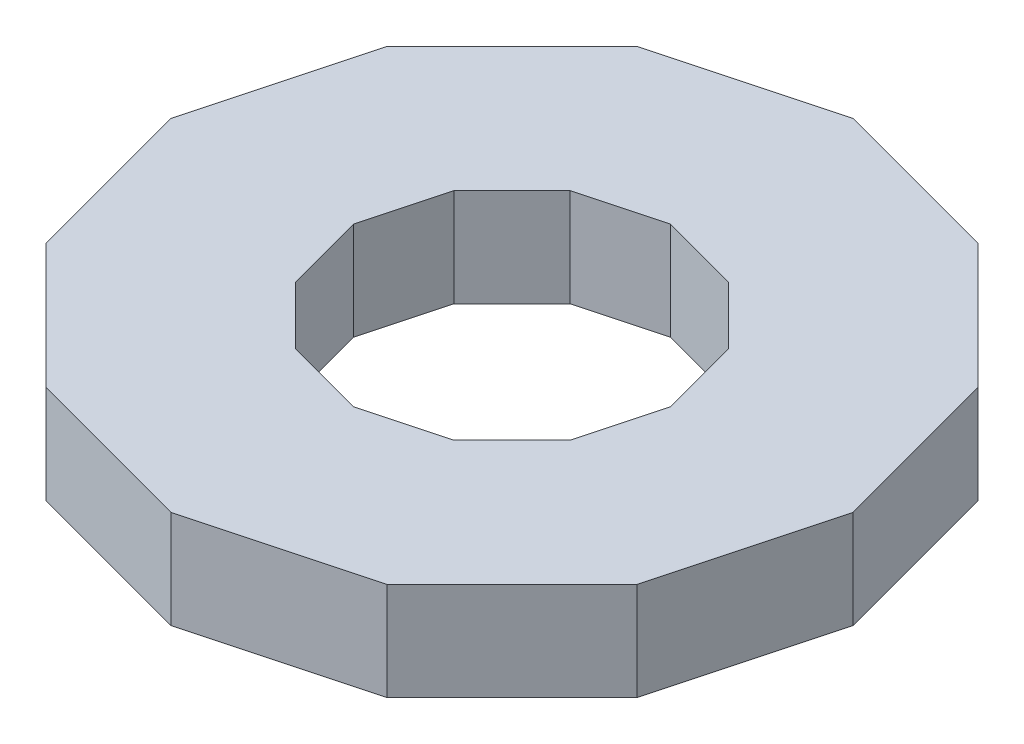
ISO-10303-21;
HEADER;
FILE_DESCRIPTION(('STEP AP214'),'2;1');
FILE_NAME('part.step','',(''),(''),'','','');
FILE_SCHEMA(('AUTOMOTIVE_DESIGN { 1 0 10303 214 1 1 1 1 }'));
ENDSEC;
DATA;
#1=APPLICATION_CONTEXT('core data for automotive mechanical design processes');
#2=APPLICATION_PROTOCOL_DEFINITION('international standard','automotive_design',2000,#1);
#3=PRODUCT_CONTEXT('',#1,'mechanical');
#4=PRODUCT('Part','Part','',(#3));
#5=PRODUCT_RELATED_PRODUCT_CATEGORY('part','',(#4));
#6=PRODUCT_DEFINITION_FORMATION('','',#4);
#7=PRODUCT_DEFINITION_CONTEXT('part definition',#1,'design');
#8=PRODUCT_DEFINITION('design','',#6,#7);
#9=PRODUCT_DEFINITION_SHAPE('','',#8);
#10=(LENGTH_UNIT() NAMED_UNIT(*) SI_UNIT(.MILLI.,.METRE.));
#11=(NAMED_UNIT(*) PLANE_ANGLE_UNIT() SI_UNIT($,.RADIAN.));
#12=(NAMED_UNIT(*) SI_UNIT($,.STERADIAN.) SOLID_ANGLE_UNIT());
#13=UNCERTAINTY_MEASURE_WITH_UNIT(LENGTH_MEASURE(1.E-05),#10,'distance_accuracy_value','');
#14=(GEOMETRIC_REPRESENTATION_CONTEXT(3) GLOBAL_UNCERTAINTY_ASSIGNED_CONTEXT((#13)) GLOBAL_UNIT_ASSIGNED_CONTEXT((#10,
#11,#12)) REPRESENTATION_CONTEXT('',''));
#15=CARTESIAN_POINT('',(0.,0.,0.));
#16=DIRECTION('',(0.,0.,1.));
#17=DIRECTION('',(1.,0.,0.));
#18=AXIS2_PLACEMENT_3D('',#15,#16,#17);
#19=CARTESIAN_POINT('',(0.,19.05,0.));
#20=DIRECTION('',(0.,1.,0.));
#21=DIRECTION('',(0.,0.,1.));
#22=AXIS2_PLACEMENT_3D('',#19,#20,#21);
#23=PLANE('',#22);
#24=DIRECTION('',(0.258819045102521,0.,-0.965925826289068));
#25=VECTOR('',#24,1.);
#26=CARTESIAN_POINT('',(57.3682881103389,19.05,33.1215965834522));
#27=LINE('',#26,#25);
#28=CARTESIAN_POINT('',(57.3682881103389,19.05,33.1215965834522));
#29=VERTEX_POINT('',#28);
#30=CARTESIAN_POINT('',(66.2431931669043,19.05,0.));
#31=VERTEX_POINT('',#30);
#32=EDGE_CURVE('E299',#29,#31,#27,.T.);
#33=ORIENTED_EDGE('',*,*,#32,.T.);
#34=DIRECTION('',(-0.25881904510252,0.,-0.965925826289068));
#35=VECTOR('',#34,1.);
#36=CARTESIAN_POINT('',(66.2431931669043,19.05,0.));
#37=LINE('',#36,#35);
#38=CARTESIAN_POINT('',(57.3682881103389,19.05,-33.1215965834521));
#39=VERTEX_POINT('',#38);
#40=EDGE_CURVE('E303',#31,#39,#37,.T.);
#41=ORIENTED_EDGE('',*,*,#40,.T.);
#42=DIRECTION('',(-0.707106781186548,0.,-0.707106781186548));
#43=VECTOR('',#42,1.);
#44=CARTESIAN_POINT('',(57.3682881103389,19.05,-33.1215965834521));
#45=LINE('',#44,#43);
#46=CARTESIAN_POINT('',(33.1215965834521,19.05,-57.3682881103389));
#47=VERTEX_POINT('',#46);
#48=EDGE_CURVE('E307',#39,#47,#45,.T.);
#49=ORIENTED_EDGE('',*,*,#48,.T.);
#50=DIRECTION('',(-0.965925826289068,0.,-0.258819045102521));
#51=VECTOR('',#50,1.);
#52=CARTESIAN_POINT('',(33.1215965834521,19.05,-57.3682881103389));
#53=LINE('',#52,#51);
#54=CARTESIAN_POINT('',(0.,19.05,-66.2431931669043));
#55=VERTEX_POINT('',#54);
#56=EDGE_CURVE('E310',#47,#55,#53,.T.);
#57=ORIENTED_EDGE('',*,*,#56,.T.);
#58=DIRECTION('',(-0.965925826289068,0.,0.258819045102521));
#59=VECTOR('',#58,1.);
#60=CARTESIAN_POINT('',(0.,19.05,-66.2431931669043));
#61=LINE('',#60,#59);
#62=CARTESIAN_POINT('',(-33.1215965834521,19.05,-57.3682881103389));
#63=VERTEX_POINT('',#62);
#64=EDGE_CURVE('E313',#55,#63,#61,.T.);
#65=ORIENTED_EDGE('',*,*,#64,.T.);
#66=DIRECTION('',(-0.707106781186548,0.,0.707106781186547));
#67=VECTOR('',#66,1.);
#68=CARTESIAN_POINT('',(-33.1215965834521,19.05,-57.3682881103389));
#69=LINE('',#68,#67);
#70=CARTESIAN_POINT('',(-57.3682881103389,19.05,-33.1215965834522));
#71=VERTEX_POINT('',#70);
#72=EDGE_CURVE('E316',#63,#71,#69,.T.);
#73=ORIENTED_EDGE('',*,*,#72,.T.);
#74=DIRECTION('',(-0.258819045102521,0.,0.965925826289068));
#75=VECTOR('',#74,1.);
#76=CARTESIAN_POINT('',(-57.3682881103389,19.05,-33.1215965834522));
#77=LINE('',#76,#75);
#78=CARTESIAN_POINT('',(-66.2431931669043,19.05,0.));
#79=VERTEX_POINT('',#78);
#80=EDGE_CURVE('E319',#71,#79,#77,.T.);
#81=ORIENTED_EDGE('',*,*,#80,.T.);
#82=DIRECTION('',(0.25881904510252,0.,0.965925826289068));
#83=VECTOR('',#82,1.);
#84=CARTESIAN_POINT('',(-66.2431931669043,19.05,0.));
#85=LINE('',#84,#83);
#86=CARTESIAN_POINT('',(-57.3682881103389,19.05,33.1215965834521));
#87=VERTEX_POINT('',#86);
#88=EDGE_CURVE('E322',#79,#87,#85,.T.);
#89=ORIENTED_EDGE('',*,*,#88,.T.);
#90=DIRECTION('',(0.707106781186548,0.,0.707106781186548));
#91=VECTOR('',#90,1.);
#92=CARTESIAN_POINT('',(-57.3682881103389,19.05,33.1215965834521));
#93=LINE('',#92,#91);
#94=CARTESIAN_POINT('',(-33.1215965834521,19.05,57.3682881103389));
#95=VERTEX_POINT('',#94);
#96=EDGE_CURVE('E325',#87,#95,#93,.T.);
#97=ORIENTED_EDGE('',*,*,#96,.T.);
#98=DIRECTION('',(0.965925826289068,0.,0.258819045102521));
#99=VECTOR('',#98,1.);
#100=CARTESIAN_POINT('',(-33.1215965834521,19.05,57.3682881103389));
#101=LINE('',#100,#99);
#102=CARTESIAN_POINT('',(0.,19.05,66.2431931669043));
#103=VERTEX_POINT('',#102);
#104=EDGE_CURVE('E327',#95,#103,#101,.T.);
#105=ORIENTED_EDGE('',*,*,#104,.T.);
#106=DIRECTION('',(0.965925826289068,0.,-0.25881904510252));
#107=VECTOR('',#106,1.);
#108=CARTESIAN_POINT('',(0.,19.05,66.2431931669043));
#109=LINE('',#108,#107);
#110=CARTESIAN_POINT('',(33.1215965834521,19.05,57.3682881103389));
#111=VERTEX_POINT('',#110);
#112=EDGE_CURVE('E329',#103,#111,#109,.T.);
#113=ORIENTED_EDGE('',*,*,#112,.T.);
#114=DIRECTION('',(0.707106781186548,0.,-0.707106781186548));
#115=VECTOR('',#114,1.);
#116=CARTESIAN_POINT('',(33.1215965834521,19.05,57.3682881103389));
#117=LINE('',#116,#115);
#118=EDGE_CURVE('E331',#111,#29,#117,.T.);
#119=ORIENTED_EDGE('',*,*,#118,.T.);
#120=EDGE_LOOP('',(#33,#41,#49,#57,#65,#73,#81,#89,#97,#105,#113,#119));
#121=FACE_BOUND('',#120,.T.);
#122=DIRECTION('',(-0.25881904510252,0.,-0.965925826289068));
#123=VECTOR('',#122,1.);
#124=CARTESIAN_POINT('',(30.7435729406426,19.05,0.));
#125=LINE('',#124,#123);
#126=CARTESIAN_POINT('',(30.7435729406426,19.05,0.));
#127=VERTEX_POINT('',#126);
#128=CARTESIAN_POINT('',(26.6247151696963,19.05,-15.3717864703213));
#129=VERTEX_POINT('',#128);
#130=EDGE_CURVE('E206',#127,#129,#125,.T.);
#131=ORIENTED_EDGE('',*,*,#130,.F.);
#132=DIRECTION('',(0.258819045102521,0.,-0.965925826289068));
#133=VECTOR('',#132,1.);
#134=CARTESIAN_POINT('',(26.6247151696963,19.05,15.3717864703213));
#135=LINE('',#134,#133);
#136=CARTESIAN_POINT('',(26.6247151696963,19.05,15.3717864703213));
#137=VERTEX_POINT('',#136);
#138=EDGE_CURVE('E197',#137,#127,#135,.T.);
#139=ORIENTED_EDGE('',*,*,#138,.F.);
#140=DIRECTION('',(0.707106781186547,0.,-0.707106781186547));
#141=VECTOR('',#140,1.);
#142=CARTESIAN_POINT('',(15.3717864703213,19.05,26.6247151696963));
#143=LINE('',#142,#141);
#144=CARTESIAN_POINT('',(15.3717864703213,19.05,26.6247151696963));
#145=VERTEX_POINT('',#144);
#146=EDGE_CURVE('E244',#145,#137,#143,.T.);
#147=ORIENTED_EDGE('',*,*,#146,.F.);
#148=DIRECTION('',(0.965925826289068,0.,-0.25881904510252));
#149=VECTOR('',#148,1.);
#150=CARTESIAN_POINT('',(0.,19.05,30.7435729406426));
#151=LINE('',#150,#149);
#152=CARTESIAN_POINT('',(0.,19.05,30.7435729406426));
#153=VERTEX_POINT('',#152);
#154=EDGE_CURVE('E242',#153,#145,#151,.T.);
#155=ORIENTED_EDGE('',*,*,#154,.F.);
#156=DIRECTION('',(0.965925826289068,0.,0.258819045102521));
#157=VECTOR('',#156,1.);
#158=CARTESIAN_POINT('',(-15.3717864703213,19.05,26.6247151696963));
#159=LINE('',#158,#157);
#160=CARTESIAN_POINT('',(-15.3717864703213,19.05,26.6247151696963));
#161=VERTEX_POINT('',#160);
#162=EDGE_CURVE('E240',#161,#153,#159,.T.);
#163=ORIENTED_EDGE('',*,*,#162,.F.);
#164=DIRECTION('',(0.707106781186548,0.,0.707106781186548));
#165=VECTOR('',#164,1.);
#166=CARTESIAN_POINT('',(-26.6247151696963,19.05,15.3717864703213));
#167=LINE('',#166,#165);
#168=CARTESIAN_POINT('',(-26.6247151696963,19.05,15.3717864703213));
#169=VERTEX_POINT('',#168);
#170=EDGE_CURVE('E238',#169,#161,#167,.T.);
#171=ORIENTED_EDGE('',*,*,#170,.F.);
#172=DIRECTION('',(0.258819045102521,0.,0.965925826289068));
#173=VECTOR('',#172,1.);
#174=CARTESIAN_POINT('',(-30.7435729406426,19.05,0.));
#175=LINE('',#174,#173);
#176=CARTESIAN_POINT('',(-30.7435729406426,19.05,0.));
#177=VERTEX_POINT('',#176);
#178=EDGE_CURVE('E236',#177,#169,#175,.T.);
#179=ORIENTED_EDGE('',*,*,#178,.F.);
#180=DIRECTION('',(-0.258819045102521,0.,0.965925826289068));
#181=VECTOR('',#180,1.);
#182=CARTESIAN_POINT('',(-26.6247151696963,19.05,-15.3717864703213));
#183=LINE('',#182,#181);
#184=CARTESIAN_POINT('',(-26.6247151696963,19.05,-15.3717864703213));
#185=VERTEX_POINT('',#184);
#186=EDGE_CURVE('E234',#185,#177,#183,.T.);
#187=ORIENTED_EDGE('',*,*,#186,.F.);
#188=DIRECTION('',(-0.707106781186548,0.,0.707106781186547));
#189=VECTOR('',#188,1.);
#190=CARTESIAN_POINT('',(-15.3717864703213,19.05,-26.6247151696963));
#191=LINE('',#190,#189);
#192=CARTESIAN_POINT('',(-15.3717864703213,19.05,-26.6247151696963));
#193=VERTEX_POINT('',#192);
#194=EDGE_CURVE('E232',#193,#185,#191,.T.);
#195=ORIENTED_EDGE('',*,*,#194,.F.);
#196=DIRECTION('',(-0.965925826289068,0.,0.258819045102521));
#197=VECTOR('',#196,1.);
#198=CARTESIAN_POINT('',(0.,19.05,-30.7435729406426));
#199=LINE('',#198,#197);
#200=CARTESIAN_POINT('',(0.,19.05,-30.7435729406426));
#201=VERTEX_POINT('',#200);
#202=EDGE_CURVE('E229',#201,#193,#199,.T.);
#203=ORIENTED_EDGE('',*,*,#202,.F.);
#204=DIRECTION('',(-0.965925826289068,0.,-0.258819045102521));
#205=VECTOR('',#204,1.);
#206=CARTESIAN_POINT('',(15.3717864703213,19.05,-26.6247151696963));
#207=LINE('',#206,#205);
#208=CARTESIAN_POINT('',(15.3717864703213,19.05,-26.6247151696963));
#209=VERTEX_POINT('',#208);
#210=EDGE_CURVE('E225',#209,#201,#207,.T.);
#211=ORIENTED_EDGE('',*,*,#210,.F.);
#212=DIRECTION('',(-0.707106781186547,0.,-0.707106781186547));
#213=VECTOR('',#212,1.);
#214=CARTESIAN_POINT('',(26.6247151696963,19.05,-15.3717864703213));
#215=LINE('',#214,#213);
#216=EDGE_CURVE('E219',#129,#209,#215,.T.);
#217=ORIENTED_EDGE('',*,*,#216,.F.);
#218=EDGE_LOOP('',(#131,#139,#147,#155,#163,#171,#179,#187,#195,#203,#211,#217));
#219=FACE_BOUND('',#218,.T.);
#220=ADVANCED_FACE('F35',(#121,#219),#23,.T.);
#221=CARTESIAN_POINT('',(0.,0.,0.));
#222=DIRECTION('',(0.,1.,0.));
#223=DIRECTION('',(0.,0.,1.));
#224=AXIS2_PLACEMENT_3D('',#221,#222,#223);
#225=PLANE('',#224);
#226=DIRECTION('',(0.258819045102521,0.,-0.965925826289068));
#227=VECTOR('',#226,1.);
#228=CARTESIAN_POINT('',(57.3682881103389,0.,33.1215965834522));
#229=LINE('',#228,#227);
#230=CARTESIAN_POINT('',(57.3682881103389,0.,33.1215965834522));
#231=VERTEX_POINT('',#230);
#232=CARTESIAN_POINT('',(66.2431931669043,0.,0.));
#233=VERTEX_POINT('',#232);
#234=EDGE_CURVE('E214',#231,#233,#229,.T.);
#235=ORIENTED_EDGE('',*,*,#234,.F.);
#236=DIRECTION('',(0.707106781186548,0.,-0.707106781186548));
#237=VECTOR('',#236,1.);
#238=CARTESIAN_POINT('',(33.1215965834521,0.,57.3682881103389));
#239=LINE('',#238,#237);
#240=CARTESIAN_POINT('',(33.1215965834521,0.,57.3682881103389));
#241=VERTEX_POINT('',#240);
#242=EDGE_CURVE('E304',#241,#231,#239,.T.);
#243=ORIENTED_EDGE('',*,*,#242,.F.);
#244=DIRECTION('',(0.965925826289068,0.,-0.25881904510252));
#245=VECTOR('',#244,1.);
#246=CARTESIAN_POINT('',(0.,0.,66.2431931669043));
#247=LINE('',#246,#245);
#248=CARTESIAN_POINT('',(0.,0.,66.2431931669043));
#249=VERTEX_POINT('',#248);
#250=EDGE_CURVE('E359',#249,#241,#247,.T.);
#251=ORIENTED_EDGE('',*,*,#250,.F.);
#252=DIRECTION('',(0.965925826289068,0.,0.258819045102521));
#253=VECTOR('',#252,1.);
#254=CARTESIAN_POINT('',(-33.1215965834521,0.,57.3682881103389));
#255=LINE('',#254,#253);
#256=CARTESIAN_POINT('',(-33.1215965834521,0.,57.3682881103389));
#257=VERTEX_POINT('',#256);
#258=EDGE_CURVE('E357',#257,#249,#255,.T.);
#259=ORIENTED_EDGE('',*,*,#258,.F.);
#260=DIRECTION('',(0.707106781186548,0.,0.707106781186548));
#261=VECTOR('',#260,1.);
#262=CARTESIAN_POINT('',(-57.3682881103389,0.,33.1215965834521));
#263=LINE('',#262,#261);
#264=CARTESIAN_POINT('',(-57.3682881103389,0.,33.1215965834521));
#265=VERTEX_POINT('',#264);
#266=EDGE_CURVE('E354',#265,#257,#263,.T.);
#267=ORIENTED_EDGE('',*,*,#266,.F.);
#268=DIRECTION('',(0.25881904510252,0.,0.965925826289068));
#269=VECTOR('',#268,1.);
#270=CARTESIAN_POINT('',(-66.2431931669043,0.,0.));
#271=LINE('',#270,#269);
#272=CARTESIAN_POINT('',(-66.2431931669043,0.,0.));
#273=VERTEX_POINT('',#272);
#274=EDGE_CURVE('E352',#273,#265,#271,.T.);
#275=ORIENTED_EDGE('',*,*,#274,.F.);
#276=DIRECTION('',(-0.258819045102521,0.,0.965925826289068));
#277=VECTOR('',#276,1.);
#278=CARTESIAN_POINT('',(-57.3682881103389,0.,-33.1215965834522));
#279=LINE('',#278,#277);
#280=CARTESIAN_POINT('',(-57.3682881103389,0.,-33.1215965834522));
#281=VERTEX_POINT('',#280);
#282=EDGE_CURVE('E349',#281,#273,#279,.T.);
#283=ORIENTED_EDGE('',*,*,#282,.F.);
#284=DIRECTION('',(-0.707106781186548,0.,0.707106781186547));
#285=VECTOR('',#284,1.);
#286=CARTESIAN_POINT('',(-33.1215965834521,0.,-57.3682881103389));
#287=LINE('',#286,#285);
#288=CARTESIAN_POINT('',(-33.1215965834521,0.,-57.3682881103389));
#289=VERTEX_POINT('',#288);
#290=EDGE_CURVE('E347',#289,#281,#287,.T.);
#291=ORIENTED_EDGE('',*,*,#290,.F.);
#292=DIRECTION('',(-0.965925826289068,0.,0.258819045102521));
#293=VECTOR('',#292,1.);
#294=CARTESIAN_POINT('',(0.,0.,-66.2431931669043));
#295=LINE('',#294,#293);
#296=CARTESIAN_POINT('',(0.,0.,-66.2431931669043));
#297=VERTEX_POINT('',#296);
#298=EDGE_CURVE('E345',#297,#289,#295,.T.);
#299=ORIENTED_EDGE('',*,*,#298,.F.);
#300=DIRECTION('',(-0.965925826289068,0.,-0.258819045102521));
#301=VECTOR('',#300,1.);
#302=CARTESIAN_POINT('',(33.1215965834521,0.,-57.3682881103389));
#303=LINE('',#302,#301);
#304=CARTESIAN_POINT('',(33.1215965834521,0.,-57.3682881103389));
#305=VERTEX_POINT('',#304);
#306=EDGE_CURVE('E343',#305,#297,#303,.T.);
#307=ORIENTED_EDGE('',*,*,#306,.F.);
#308=DIRECTION('',(-0.707106781186548,0.,-0.707106781186548));
#309=VECTOR('',#308,1.);
#310=CARTESIAN_POINT('',(57.3682881103389,0.,-33.1215965834521));
#311=LINE('',#310,#309);
#312=CARTESIAN_POINT('',(57.3682881103389,0.,-33.1215965834521));
#313=VERTEX_POINT('',#312);
#314=EDGE_CURVE('E340',#313,#305,#311,.T.);
#315=ORIENTED_EDGE('',*,*,#314,.F.);
#316=DIRECTION('',(-0.25881904510252,0.,-0.965925826289068));
#317=VECTOR('',#316,1.);
#318=CARTESIAN_POINT('',(66.2431931669043,0.,0.));
#319=LINE('',#318,#317);
#320=EDGE_CURVE('E337',#233,#313,#319,.T.);
#321=ORIENTED_EDGE('',*,*,#320,.F.);
#322=EDGE_LOOP('',(#235,#243,#251,#259,#267,#275,#283,#291,#299,#307,#315,#321));
#323=FACE_BOUND('',#322,.T.);
#324=DIRECTION('',(0.258819045102521,0.,-0.965925826289068));
#325=VECTOR('',#324,1.);
#326=CARTESIAN_POINT('',(26.6247151696963,0.,15.3717864703213));
#327=LINE('',#326,#325);
#328=CARTESIAN_POINT('',(26.6247151696963,0.,15.3717864703213));
#329=VERTEX_POINT('',#328);
#330=CARTESIAN_POINT('',(30.7435729406426,0.,0.));
#331=VERTEX_POINT('',#330);
#332=EDGE_CURVE('E59',#329,#331,#327,.T.);
#333=ORIENTED_EDGE('',*,*,#332,.T.);
#334=DIRECTION('',(-0.25881904510252,0.,-0.965925826289068));
#335=VECTOR('',#334,1.);
#336=CARTESIAN_POINT('',(30.7435729406426,0.,0.));
#337=LINE('',#336,#335);
#338=CARTESIAN_POINT('',(26.6247151696963,0.,-15.3717864703213));
#339=VERTEX_POINT('',#338);
#340=EDGE_CURVE('E213',#331,#339,#337,.T.);
#341=ORIENTED_EDGE('',*,*,#340,.T.);
#342=DIRECTION('',(-0.707106781186547,0.,-0.707106781186547));
#343=VECTOR('',#342,1.);
#344=CARTESIAN_POINT('',(26.6247151696963,0.,-15.3717864703213));
#345=LINE('',#344,#343);
#346=CARTESIAN_POINT('',(15.3717864703213,0.,-26.6247151696963));
#347=VERTEX_POINT('',#346);
#348=EDGE_CURVE('E249',#339,#347,#345,.T.);
#349=ORIENTED_EDGE('',*,*,#348,.T.);
#350=DIRECTION('',(-0.965925826289068,0.,-0.258819045102521));
#351=VECTOR('',#350,1.);
#352=CARTESIAN_POINT('',(15.3717864703213,0.,-26.6247151696963));
#353=LINE('',#352,#351);
#354=CARTESIAN_POINT('',(0.,0.,-30.7435729406426));
#355=VERTEX_POINT('',#354);
#356=EDGE_CURVE('E252',#347,#355,#353,.T.);
#357=ORIENTED_EDGE('',*,*,#356,.T.);
#358=DIRECTION('',(-0.965925826289068,0.,0.258819045102521));
#359=VECTOR('',#358,1.);
#360=CARTESIAN_POINT('',(0.,0.,-30.7435729406426));
#361=LINE('',#360,#359);
#362=CARTESIAN_POINT('',(-15.3717864703213,0.,-26.6247151696963));
#363=VERTEX_POINT('',#362);
#364=EDGE_CURVE('E256',#355,#363,#361,.T.);
#365=ORIENTED_EDGE('',*,*,#364,.T.);
#366=DIRECTION('',(-0.707106781186548,0.,0.707106781186547));
#367=VECTOR('',#366,1.);
#368=CARTESIAN_POINT('',(-15.3717864703213,0.,-26.6247151696963));
#369=LINE('',#368,#367);
#370=CARTESIAN_POINT('',(-26.6247151696963,0.,-15.3717864703213));
#371=VERTEX_POINT('',#370);
#372=EDGE_CURVE('E259',#363,#371,#369,.T.);
#373=ORIENTED_EDGE('',*,*,#372,.T.);
#374=DIRECTION('',(-0.258819045102521,0.,0.965925826289068));
#375=VECTOR('',#374,1.);
#376=CARTESIAN_POINT('',(-26.6247151696963,0.,-15.3717864703213));
#377=LINE('',#376,#375);
#378=CARTESIAN_POINT('',(-30.7435729406426,0.,0.));
#379=VERTEX_POINT('',#378);
#380=EDGE_CURVE('E262',#371,#379,#377,.T.);
#381=ORIENTED_EDGE('',*,*,#380,.T.);
#382=DIRECTION('',(0.258819045102521,0.,0.965925826289068));
#383=VECTOR('',#382,1.);
#384=CARTESIAN_POINT('',(-30.7435729406426,0.,0.));
#385=LINE('',#384,#383);
#386=CARTESIAN_POINT('',(-26.6247151696963,0.,15.3717864703213));
#387=VERTEX_POINT('',#386);
#388=EDGE_CURVE('E265',#379,#387,#385,.T.);
#389=ORIENTED_EDGE('',*,*,#388,.T.);
#390=DIRECTION('',(0.707106781186548,0.,0.707106781186548));
#391=VECTOR('',#390,1.);
#392=CARTESIAN_POINT('',(-26.6247151696963,0.,15.3717864703213));
#393=LINE('',#392,#391);
#394=CARTESIAN_POINT('',(-15.3717864703213,0.,26.6247151696963));
#395=VERTEX_POINT('',#394);
#396=EDGE_CURVE('E268',#387,#395,#393,.T.);
#397=ORIENTED_EDGE('',*,*,#396,.T.);
#398=DIRECTION('',(0.965925826289068,0.,0.258819045102521));
#399=VECTOR('',#398,1.);
#400=CARTESIAN_POINT('',(-15.3717864703213,0.,26.6247151696963));
#401=LINE('',#400,#399);
#402=CARTESIAN_POINT('',(0.,0.,30.7435729406426));
#403=VERTEX_POINT('',#402);
#404=EDGE_CURVE('E271',#395,#403,#401,.T.);
#405=ORIENTED_EDGE('',*,*,#404,.T.);
#406=DIRECTION('',(0.965925826289068,0.,-0.25881904510252));
#407=VECTOR('',#406,1.);
#408=CARTESIAN_POINT('',(0.,0.,30.7435729406426));
#409=LINE('',#408,#407);
#410=CARTESIAN_POINT('',(15.3717864703213,0.,26.6247151696963));
#411=VERTEX_POINT('',#410);
#412=EDGE_CURVE('E274',#403,#411,#409,.T.);
#413=ORIENTED_EDGE('',*,*,#412,.T.);
#414=DIRECTION('',(0.707106781186547,0.,-0.707106781186547));
#415=VECTOR('',#414,1.);
#416=CARTESIAN_POINT('',(15.3717864703213,0.,26.6247151696963));
#417=LINE('',#416,#415);
#418=EDGE_CURVE('E207',#411,#329,#417,.T.);
#419=ORIENTED_EDGE('',*,*,#418,.T.);
#420=EDGE_LOOP('',(#333,#341,#349,#357,#365,#373,#381,#389,#397,#405,#413,#419));
#421=FACE_BOUND('',#420,.T.);
#422=ADVANCED_FACE('F405',(#323,#421),#225,.F.);
#423=CARTESIAN_POINT('',(57.3682881103389,19.05,33.1215965834522));
#424=DIRECTION('',(-0.965925826289068,0.,-0.258819045102521));
#425=DIRECTION('',(-0.258819045102521,0.,0.965925826289068));
#426=AXIS2_PLACEMENT_3D('',#423,#424,#425);
#427=PLANE('',#426);
#428=ORIENTED_EDGE('',*,*,#234,.T.);
#429=DIRECTION('',(0.,-1.,0.));
#430=VECTOR('',#429,1.);
#431=CARTESIAN_POINT('',(66.2431931669043,19.05,0.));
#432=LINE('',#431,#430);
#433=EDGE_CURVE('E11',#31,#233,#432,.T.);
#434=ORIENTED_EDGE('',*,*,#433,.F.);
#435=ORIENTED_EDGE('',*,*,#32,.F.);
#436=DIRECTION('',(0.,-1.,0.));
#437=VECTOR('',#436,1.);
#438=CARTESIAN_POINT('',(57.3682881103389,19.05,33.1215965834522));
#439=LINE('',#438,#437);
#440=EDGE_CURVE('E333',#29,#231,#439,.T.);
#441=ORIENTED_EDGE('',*,*,#440,.T.);
#442=EDGE_LOOP('',(#428,#434,#435,#441));
#443=FACE_BOUND('',#442,.T.);
#444=ADVANCED_FACE('F37',(#443),#427,.F.);
#445=CARTESIAN_POINT('',(66.2431931669043,19.05,0.));
#446=DIRECTION('',(-0.965925826289068,0.,0.25881904510252));
#447=DIRECTION('',(0.25881904510252,0.,0.965925826289068));
#448=AXIS2_PLACEMENT_3D('',#445,#446,#447);
#449=PLANE('',#448);
#450=ORIENTED_EDGE('',*,*,#320,.T.);
#451=DIRECTION('',(0.,-1.,0.));
#452=VECTOR('',#451,1.);
#453=CARTESIAN_POINT('',(57.3682881103389,19.05,-33.1215965834521));
#454=LINE('',#453,#452);
#455=EDGE_CURVE('E44',#39,#313,#454,.T.);
#456=ORIENTED_EDGE('',*,*,#455,.F.);
#457=ORIENTED_EDGE('',*,*,#40,.F.);
#458=ORIENTED_EDGE('',*,*,#433,.T.);
#459=EDGE_LOOP('',(#450,#456,#457,#458));
#460=FACE_BOUND('',#459,.T.);
#461=ADVANCED_FACE('F422',(#460),#449,.F.);
#462=CARTESIAN_POINT('',(57.3682881103389,19.05,-33.1215965834521));
#463=DIRECTION('',(-0.707106781186548,0.,0.707106781186548));
#464=DIRECTION('',(0.707106781186548,0.,0.707106781186548));
#465=AXIS2_PLACEMENT_3D('',#462,#463,#464);
#466=PLANE('',#465);
#467=ORIENTED_EDGE('',*,*,#314,.T.);
#468=DIRECTION('',(0.,-1.,0.));
#469=VECTOR('',#468,1.);
#470=CARTESIAN_POINT('',(33.1215965834521,19.05,-57.3682881103389));
#471=LINE('',#470,#469);
#472=EDGE_CURVE('E392',#47,#305,#471,.T.);
#473=ORIENTED_EDGE('',*,*,#472,.F.);
#474=ORIENTED_EDGE('',*,*,#48,.F.);
#475=ORIENTED_EDGE('',*,*,#455,.T.);
#476=EDGE_LOOP('',(#467,#473,#474,#475));
#477=FACE_BOUND('',#476,.T.);
#478=ADVANCED_FACE('F399',(#477),#466,.F.);
#479=CARTESIAN_POINT('',(33.1215965834521,19.05,-57.3682881103389));
#480=DIRECTION('',(-0.258819045102521,0.,0.965925826289068));
#481=DIRECTION('',(0.965925826289068,0.,0.258819045102521));
#482=AXIS2_PLACEMENT_3D('',#479,#480,#481);
#483=PLANE('',#482);
#484=ORIENTED_EDGE('',*,*,#306,.T.);
#485=DIRECTION('',(0.,-1.,0.));
#486=VECTOR('',#485,1.);
#487=CARTESIAN_POINT('',(0.,19.05,-66.2431931669043));
#488=LINE('',#487,#486);
#489=EDGE_CURVE('E389',#55,#297,#488,.T.);
#490=ORIENTED_EDGE('',*,*,#489,.F.);
#491=ORIENTED_EDGE('',*,*,#56,.F.);
#492=ORIENTED_EDGE('',*,*,#472,.T.);
#493=EDGE_LOOP('',(#484,#490,#491,#492));
#494=FACE_BOUND('',#493,.T.);
#495=ADVANCED_FACE('F411',(#494),#483,.F.);
#496=CARTESIAN_POINT('',(0.,19.05,-66.2431931669043));
#497=DIRECTION('',(0.258819045102521,0.,0.965925826289068));
#498=DIRECTION('',(0.965925826289068,0.,-0.258819045102521));
#499=AXIS2_PLACEMENT_3D('',#496,#497,#498);
#500=PLANE('',#499);
#501=ORIENTED_EDGE('',*,*,#298,.T.);
#502=DIRECTION('',(0.,-1.,0.));
#503=VECTOR('',#502,1.);
#504=CARTESIAN_POINT('',(-33.1215965834521,19.05,-57.3682881103389));
#505=LINE('',#504,#503);
#506=EDGE_CURVE('E385',#63,#289,#505,.T.);
#507=ORIENTED_EDGE('',*,*,#506,.F.);
#508=ORIENTED_EDGE('',*,*,#64,.F.);
#509=ORIENTED_EDGE('',*,*,#489,.T.);
#510=EDGE_LOOP('',(#501,#507,#508,#509));
#511=FACE_BOUND('',#510,.T.);
#512=ADVANCED_FACE('F415',(#511),#500,.F.);
#513=CARTESIAN_POINT('',(-33.1215965834521,19.05,-57.3682881103389));
#514=DIRECTION('',(0.707106781186547,0.,0.707106781186548));
#515=DIRECTION('',(0.707106781186548,0.,-0.707106781186547));
#516=AXIS2_PLACEMENT_3D('',#513,#514,#515);
#517=PLANE('',#516);
#518=ORIENTED_EDGE('',*,*,#290,.T.);
#519=DIRECTION('',(0.,-1.,0.));
#520=VECTOR('',#519,1.);
#521=CARTESIAN_POINT('',(-57.3682881103389,19.05,-33.1215965834522));
#522=LINE('',#521,#520);
#523=EDGE_CURVE('E382',#71,#281,#522,.T.);
#524=ORIENTED_EDGE('',*,*,#523,.F.);
#525=ORIENTED_EDGE('',*,*,#72,.F.);
#526=ORIENTED_EDGE('',*,*,#506,.T.);
#527=EDGE_LOOP('',(#518,#524,#525,#526));
#528=FACE_BOUND('',#527,.T.);
#529=ADVANCED_FACE('F455',(#528),#517,.F.);
#530=CARTESIAN_POINT('',(-57.3682881103389,19.05,-33.1215965834522));
#531=DIRECTION('',(0.965925826289068,0.,0.258819045102521));
#532=DIRECTION('',(0.258819045102521,0.,-0.965925826289068));
#533=AXIS2_PLACEMENT_3D('',#530,#531,#532);
#534=PLANE('',#533);
#535=ORIENTED_EDGE('',*,*,#282,.T.);
#536=DIRECTION('',(0.,-1.,0.));
#537=VECTOR('',#536,1.);
#538=CARTESIAN_POINT('',(-66.2431931669043,19.05,0.));
#539=LINE('',#538,#537);
#540=EDGE_CURVE('E379',#79,#273,#539,.T.);
#541=ORIENTED_EDGE('',*,*,#540,.F.);
#542=ORIENTED_EDGE('',*,*,#80,.F.);
#543=ORIENTED_EDGE('',*,*,#523,.T.);
#544=EDGE_LOOP('',(#535,#541,#542,#543));
#545=FACE_BOUND('',#544,.T.);
#546=ADVANCED_FACE('F453',(#545),#534,.F.);
#547=CARTESIAN_POINT('',(-66.2431931669043,19.05,0.));
#548=DIRECTION('',(0.965925826289068,0.,-0.25881904510252));
#549=DIRECTION('',(-0.25881904510252,0.,-0.965925826289069));
#550=AXIS2_PLACEMENT_3D('',#547,#548,#549);
#551=PLANE('',#550);
#552=ORIENTED_EDGE('',*,*,#274,.T.);
#553=DIRECTION('',(0.,-1.,0.));
#554=VECTOR('',#553,1.);
#555=CARTESIAN_POINT('',(-57.3682881103389,19.05,33.1215965834521));
#556=LINE('',#555,#554);
#557=EDGE_CURVE('E375',#87,#265,#556,.T.);
#558=ORIENTED_EDGE('',*,*,#557,.F.);
#559=ORIENTED_EDGE('',*,*,#88,.F.);
#560=ORIENTED_EDGE('',*,*,#540,.T.);
#561=EDGE_LOOP('',(#552,#558,#559,#560));
#562=FACE_BOUND('',#561,.T.);
#563=ADVANCED_FACE('F449',(#562),#551,.F.);
#564=CARTESIAN_POINT('',(-57.3682881103389,19.05,33.1215965834521));
#565=DIRECTION('',(0.707106781186548,0.,-0.707106781186548));
#566=DIRECTION('',(-0.707106781186548,0.,-0.707106781186548));
#567=AXIS2_PLACEMENT_3D('',#564,#565,#566);
#568=PLANE('',#567);
#569=ORIENTED_EDGE('',*,*,#266,.T.);
#570=DIRECTION('',(0.,-1.,0.));
#571=VECTOR('',#570,1.);
#572=CARTESIAN_POINT('',(-33.1215965834521,19.05,57.3682881103389));
#573=LINE('',#572,#571);
#574=EDGE_CURVE('E371',#95,#257,#573,.T.);
#575=ORIENTED_EDGE('',*,*,#574,.F.);
#576=ORIENTED_EDGE('',*,*,#96,.F.);
#577=ORIENTED_EDGE('',*,*,#557,.T.);
#578=EDGE_LOOP('',(#569,#575,#576,#577));
#579=FACE_BOUND('',#578,.T.);
#580=ADVANCED_FACE('F444',(#579),#568,.F.);
#581=CARTESIAN_POINT('',(-33.1215965834521,19.05,57.3682881103389));
#582=DIRECTION('',(0.258819045102521,0.,-0.965925826289068));
#583=DIRECTION('',(-0.965925826289068,0.,-0.258819045102521));
#584=AXIS2_PLACEMENT_3D('',#581,#582,#583);
#585=PLANE('',#584);
#586=ORIENTED_EDGE('',*,*,#258,.T.);
#587=DIRECTION('',(0.,-1.,0.));
#588=VECTOR('',#587,1.);
#589=CARTESIAN_POINT('',(0.,19.05,66.2431931669043));
#590=LINE('',#589,#588);
#591=EDGE_CURVE('E367',#103,#249,#590,.T.);
#592=ORIENTED_EDGE('',*,*,#591,.F.);
#593=ORIENTED_EDGE('',*,*,#104,.F.);
#594=ORIENTED_EDGE('',*,*,#574,.T.);
#595=EDGE_LOOP('',(#586,#592,#593,#594));
#596=FACE_BOUND('',#595,.T.);
#597=ADVANCED_FACE('F438',(#596),#585,.F.);
#598=CARTESIAN_POINT('',(0.,19.05,66.2431931669043));
#599=DIRECTION('',(-0.25881904510252,0.,-0.965925826289068));
#600=DIRECTION('',(-0.965925826289069,0.,0.25881904510252));
#601=AXIS2_PLACEMENT_3D('',#598,#599,#600);
#602=PLANE('',#601);
#603=ORIENTED_EDGE('',*,*,#250,.T.);
#604=DIRECTION('',(0.,-1.,0.));
#605=VECTOR('',#604,1.);
#606=CARTESIAN_POINT('',(33.1215965834521,19.05,57.3682881103389));
#607=LINE('',#606,#605);
#608=EDGE_CURVE('E364',#111,#241,#607,.T.);
#609=ORIENTED_EDGE('',*,*,#608,.F.);
#610=ORIENTED_EDGE('',*,*,#112,.F.);
#611=ORIENTED_EDGE('',*,*,#591,.T.);
#612=EDGE_LOOP('',(#603,#609,#610,#611));
#613=FACE_BOUND('',#612,.T.);
#614=ADVANCED_FACE('F434',(#613),#602,.F.);
#615=CARTESIAN_POINT('',(33.1215965834521,19.05,57.3682881103389));
#616=DIRECTION('',(-0.707106781186547,0.,-0.707106781186548));
#617=DIRECTION('',(-0.707106781186548,0.,0.707106781186547));
#618=AXIS2_PLACEMENT_3D('',#615,#616,#617);
#619=PLANE('',#618);
#620=ORIENTED_EDGE('',*,*,#242,.T.);
#621=ORIENTED_EDGE('',*,*,#440,.F.);
#622=ORIENTED_EDGE('',*,*,#118,.F.);
#623=ORIENTED_EDGE('',*,*,#608,.T.);
#624=EDGE_LOOP('',(#620,#621,#622,#623));
#625=FACE_BOUND('',#624,.T.);
#626=ADVANCED_FACE('F429',(#625),#619,.F.);
#627=CARTESIAN_POINT('',(26.6247151696963,19.05,15.3717864703213));
#628=DIRECTION('',(-0.965925826289068,0.,-0.258819045102521));
#629=DIRECTION('',(-0.258819045102521,0.,0.965925826289068));
#630=AXIS2_PLACEMENT_3D('',#627,#628,#629);
#631=PLANE('',#630);
#632=ORIENTED_EDGE('',*,*,#332,.F.);
#633=DIRECTION('',(0.,-1.,0.));
#634=VECTOR('',#633,1.);
#635=CARTESIAN_POINT('',(26.6247151696963,19.05,15.3717864703213));
#636=LINE('',#635,#634);
#637=EDGE_CURVE('E201',#137,#329,#636,.T.);
#638=ORIENTED_EDGE('',*,*,#637,.F.);
#639=ORIENTED_EDGE('',*,*,#138,.T.);
#640=DIRECTION('',(0.,-1.,0.));
#641=VECTOR('',#640,1.);
#642=CARTESIAN_POINT('',(30.7435729406426,19.05,0.));
#643=LINE('',#642,#641);
#644=EDGE_CURVE('E200',#127,#331,#643,.T.);
#645=ORIENTED_EDGE('',*,*,#644,.T.);
#646=EDGE_LOOP('',(#632,#638,#639,#645));
#647=FACE_BOUND('',#646,.T.);
#648=ADVANCED_FACE('F199',(#647),#631,.T.);
#649=CARTESIAN_POINT('',(30.7435729406426,19.05,0.));
#650=DIRECTION('',(-0.965925826289068,0.,0.25881904510252));
#651=DIRECTION('',(0.25881904510252,0.,0.965925826289068));
#652=AXIS2_PLACEMENT_3D('',#649,#650,#651);
#653=PLANE('',#652);
#654=ORIENTED_EDGE('',*,*,#340,.F.);
#655=ORIENTED_EDGE('',*,*,#644,.F.);
#656=ORIENTED_EDGE('',*,*,#130,.T.);
#657=DIRECTION('',(0.,-1.,0.));
#658=VECTOR('',#657,1.);
#659=CARTESIAN_POINT('',(26.6247151696963,19.05,-15.3717864703213));
#660=LINE('',#659,#658);
#661=EDGE_CURVE('E215',#129,#339,#660,.T.);
#662=ORIENTED_EDGE('',*,*,#661,.T.);
#663=EDGE_LOOP('',(#654,#655,#656,#662));
#664=FACE_BOUND('',#663,.T.);
#665=ADVANCED_FACE('F210',(#664),#653,.T.);
#666=CARTESIAN_POINT('',(26.6247151696963,19.05,-15.3717864703213));
#667=DIRECTION('',(-0.707106781186547,0.,0.707106781186547));
#668=DIRECTION('',(0.707106781186548,0.,0.707106781186548));
#669=AXIS2_PLACEMENT_3D('',#666,#667,#668);
#670=PLANE('',#669);
#671=ORIENTED_EDGE('',*,*,#348,.F.);
#672=ORIENTED_EDGE('',*,*,#661,.F.);
#673=ORIENTED_EDGE('',*,*,#216,.T.);
#674=DIRECTION('',(0.,-1.,0.));
#675=VECTOR('',#674,1.);
#676=CARTESIAN_POINT('',(15.3717864703213,19.05,-26.6247151696963));
#677=LINE('',#676,#675);
#678=EDGE_CURVE('E296',#209,#347,#677,.T.);
#679=ORIENTED_EDGE('',*,*,#678,.T.);
#680=EDGE_LOOP('',(#671,#672,#673,#679));
#681=FACE_BOUND('',#680,.T.);
#682=ADVANCED_FACE('F513',(#681),#670,.T.);
#683=CARTESIAN_POINT('',(15.3717864703213,19.05,-26.6247151696963));
#684=DIRECTION('',(-0.258819045102521,0.,0.965925826289068));
#685=DIRECTION('',(0.965925826289068,0.,0.258819045102521));
#686=AXIS2_PLACEMENT_3D('',#683,#684,#685);
#687=PLANE('',#686);
#688=ORIENTED_EDGE('',*,*,#356,.F.);
#689=ORIENTED_EDGE('',*,*,#678,.F.);
#690=ORIENTED_EDGE('',*,*,#210,.T.);
#691=DIRECTION('',(0.,-1.,0.));
#692=VECTOR('',#691,1.);
#693=CARTESIAN_POINT('',(0.,19.05,-30.7435729406426));
#694=LINE('',#693,#692);
#695=EDGE_CURVE('E294',#201,#355,#694,.T.);
#696=ORIENTED_EDGE('',*,*,#695,.T.);
#697=EDGE_LOOP('',(#688,#689,#690,#696));
#698=FACE_BOUND('',#697,.T.);
#699=ADVANCED_FACE('F519',(#698),#687,.T.);
#700=CARTESIAN_POINT('',(0.,19.05,-30.7435729406426));
#701=DIRECTION('',(0.258819045102521,0.,0.965925826289068));
#702=DIRECTION('',(0.965925826289068,0.,-0.258819045102521));
#703=AXIS2_PLACEMENT_3D('',#700,#701,#702);
#704=PLANE('',#703);
#705=ORIENTED_EDGE('',*,*,#364,.F.);
#706=ORIENTED_EDGE('',*,*,#695,.F.);
#707=ORIENTED_EDGE('',*,*,#202,.T.);
#708=DIRECTION('',(0.,-1.,0.));
#709=VECTOR('',#708,1.);
#710=CARTESIAN_POINT('',(-15.3717864703213,19.05,-26.6247151696963));
#711=LINE('',#710,#709);
#712=EDGE_CURVE('E292',#193,#363,#711,.T.);
#713=ORIENTED_EDGE('',*,*,#712,.T.);
#714=EDGE_LOOP('',(#705,#706,#707,#713));
#715=FACE_BOUND('',#714,.T.);
#716=ADVANCED_FACE('F527',(#715),#704,.T.);
#717=CARTESIAN_POINT('',(-15.3717864703213,19.05,-26.6247151696963));
#718=DIRECTION('',(0.707106781186547,0.,0.707106781186548));
#719=DIRECTION('',(0.707106781186548,0.,-0.707106781186547));
#720=AXIS2_PLACEMENT_3D('',#717,#718,#719);
#721=PLANE('',#720);
#722=ORIENTED_EDGE('',*,*,#372,.F.);
#723=ORIENTED_EDGE('',*,*,#712,.F.);
#724=ORIENTED_EDGE('',*,*,#194,.T.);
#725=DIRECTION('',(0.,-1.,0.));
#726=VECTOR('',#725,1.);
#727=CARTESIAN_POINT('',(-26.6247151696963,19.05,-15.3717864703213));
#728=LINE('',#727,#726);
#729=EDGE_CURVE('E290',#185,#371,#728,.T.);
#730=ORIENTED_EDGE('',*,*,#729,.T.);
#731=EDGE_LOOP('',(#722,#723,#724,#730));
#732=FACE_BOUND('',#731,.T.);
#733=ADVANCED_FACE('F535',(#732),#721,.T.);
#734=CARTESIAN_POINT('',(-26.6247151696963,19.05,-15.3717864703213));
#735=DIRECTION('',(0.965925826289068,0.,0.258819045102521));
#736=DIRECTION('',(0.258819045102521,0.,-0.965925826289068));
#737=AXIS2_PLACEMENT_3D('',#734,#735,#736);
#738=PLANE('',#737);
#739=ORIENTED_EDGE('',*,*,#380,.F.);
#740=ORIENTED_EDGE('',*,*,#729,.F.);
#741=ORIENTED_EDGE('',*,*,#186,.T.);
#742=DIRECTION('',(0.,-1.,0.));
#743=VECTOR('',#742,1.);
#744=CARTESIAN_POINT('',(-30.7435729406426,19.05,0.));
#745=LINE('',#744,#743);
#746=EDGE_CURVE('E287',#177,#379,#745,.T.);
#747=ORIENTED_EDGE('',*,*,#746,.T.);
#748=EDGE_LOOP('',(#739,#740,#741,#747));
#749=FACE_BOUND('',#748,.T.);
#750=ADVANCED_FACE('F543',(#749),#738,.T.);
#751=CARTESIAN_POINT('',(-30.7435729406426,19.05,0.));
#752=DIRECTION('',(0.965925826289068,0.,-0.258819045102521));
#753=DIRECTION('',(-0.258819045102521,0.,-0.965925826289068));
#754=AXIS2_PLACEMENT_3D('',#751,#752,#753);
#755=PLANE('',#754);
#756=ORIENTED_EDGE('',*,*,#388,.F.);
#757=ORIENTED_EDGE('',*,*,#746,.F.);
#758=ORIENTED_EDGE('',*,*,#178,.T.);
#759=DIRECTION('',(0.,-1.,0.));
#760=VECTOR('',#759,1.);
#761=CARTESIAN_POINT('',(-26.6247151696963,19.05,15.3717864703213));
#762=LINE('',#761,#760);
#763=EDGE_CURVE('E285',#169,#387,#762,.T.);
#764=ORIENTED_EDGE('',*,*,#763,.T.);
#765=EDGE_LOOP('',(#756,#757,#758,#764));
#766=FACE_BOUND('',#765,.T.);
#767=ADVANCED_FACE('F551',(#766),#755,.T.);
#768=CARTESIAN_POINT('',(-26.6247151696963,19.05,15.3717864703213));
#769=DIRECTION('',(0.707106781186548,0.,-0.707106781186548));
#770=DIRECTION('',(-0.707106781186548,0.,-0.707106781186548));
#771=AXIS2_PLACEMENT_3D('',#768,#769,#770);
#772=PLANE('',#771);
#773=ORIENTED_EDGE('',*,*,#396,.F.);
#774=ORIENTED_EDGE('',*,*,#763,.F.);
#775=ORIENTED_EDGE('',*,*,#170,.T.);
#776=DIRECTION('',(0.,-1.,0.));
#777=VECTOR('',#776,1.);
#778=CARTESIAN_POINT('',(-15.3717864703213,19.05,26.6247151696963));
#779=LINE('',#778,#777);
#780=EDGE_CURVE('E283',#161,#395,#779,.T.);
#781=ORIENTED_EDGE('',*,*,#780,.T.);
#782=EDGE_LOOP('',(#773,#774,#775,#781));
#783=FACE_BOUND('',#782,.T.);
#784=ADVANCED_FACE('F559',(#783),#772,.T.);
#785=CARTESIAN_POINT('',(-15.3717864703213,19.05,26.6247151696963));
#786=DIRECTION('',(0.258819045102521,0.,-0.965925826289068));
#787=DIRECTION('',(-0.965925826289068,0.,-0.258819045102521));
#788=AXIS2_PLACEMENT_3D('',#785,#786,#787);
#789=PLANE('',#788);
#790=ORIENTED_EDGE('',*,*,#404,.F.);
#791=ORIENTED_EDGE('',*,*,#780,.F.);
#792=ORIENTED_EDGE('',*,*,#162,.T.);
#793=DIRECTION('',(0.,-1.,0.));
#794=VECTOR('',#793,1.);
#795=CARTESIAN_POINT('',(0.,19.05,30.7435729406426));
#796=LINE('',#795,#794);
#797=EDGE_CURVE('E281',#153,#403,#796,.T.);
#798=ORIENTED_EDGE('',*,*,#797,.T.);
#799=EDGE_LOOP('',(#790,#791,#792,#798));
#800=FACE_BOUND('',#799,.T.);
#801=ADVANCED_FACE('F567',(#800),#789,.T.);
#802=CARTESIAN_POINT('',(0.,19.05,30.7435729406426));
#803=DIRECTION('',(-0.25881904510252,0.,-0.965925826289068));
#804=DIRECTION('',(-0.965925826289069,0.,0.258819045102521));
#805=AXIS2_PLACEMENT_3D('',#802,#803,#804);
#806=PLANE('',#805);
#807=ORIENTED_EDGE('',*,*,#412,.F.);
#808=ORIENTED_EDGE('',*,*,#797,.F.);
#809=ORIENTED_EDGE('',*,*,#154,.T.);
#810=DIRECTION('',(0.,-1.,0.));
#811=VECTOR('',#810,1.);
#812=CARTESIAN_POINT('',(15.3717864703213,19.05,26.6247151696963));
#813=LINE('',#812,#811);
#814=EDGE_CURVE('E51',#145,#411,#813,.T.);
#815=ORIENTED_EDGE('',*,*,#814,.T.);
#816=EDGE_LOOP('',(#807,#808,#809,#815));
#817=FACE_BOUND('',#816,.T.);
#818=ADVANCED_FACE('F575',(#817),#806,.T.);
#819=CARTESIAN_POINT('',(15.3717864703213,19.05,26.6247151696963));
#820=DIRECTION('',(-0.707106781186547,0.,-0.707106781186547));
#821=DIRECTION('',(-0.707106781186548,0.,0.707106781186548));
#822=AXIS2_PLACEMENT_3D('',#819,#820,#821);
#823=PLANE('',#822);
#824=ORIENTED_EDGE('',*,*,#418,.F.);
#825=ORIENTED_EDGE('',*,*,#814,.F.);
#826=ORIENTED_EDGE('',*,*,#146,.T.);
#827=ORIENTED_EDGE('',*,*,#637,.T.);
#828=EDGE_LOOP('',(#824,#825,#826,#827));
#829=FACE_BOUND('',#828,.T.);
#830=ADVANCED_FACE('F583',(#829),#823,.T.);
#831=CLOSED_SHELL('',(#220,#422,#444,#461,#478,#495,#512,#529,#546,#563,#580,#597,#614,#626,
#648,#665,#682,#699,#716,#733,#750,#767,#784,#801,#818,#830));
#832=MANIFOLD_SOLID_BREP('B2',#831);
#833=ADVANCED_BREP_SHAPE_REPRESENTATION('',(#18,#832),#14);
#834=SHAPE_DEFINITION_REPRESENTATION(#9,#833);
ENDSEC;
END-ISO-10303-21;
